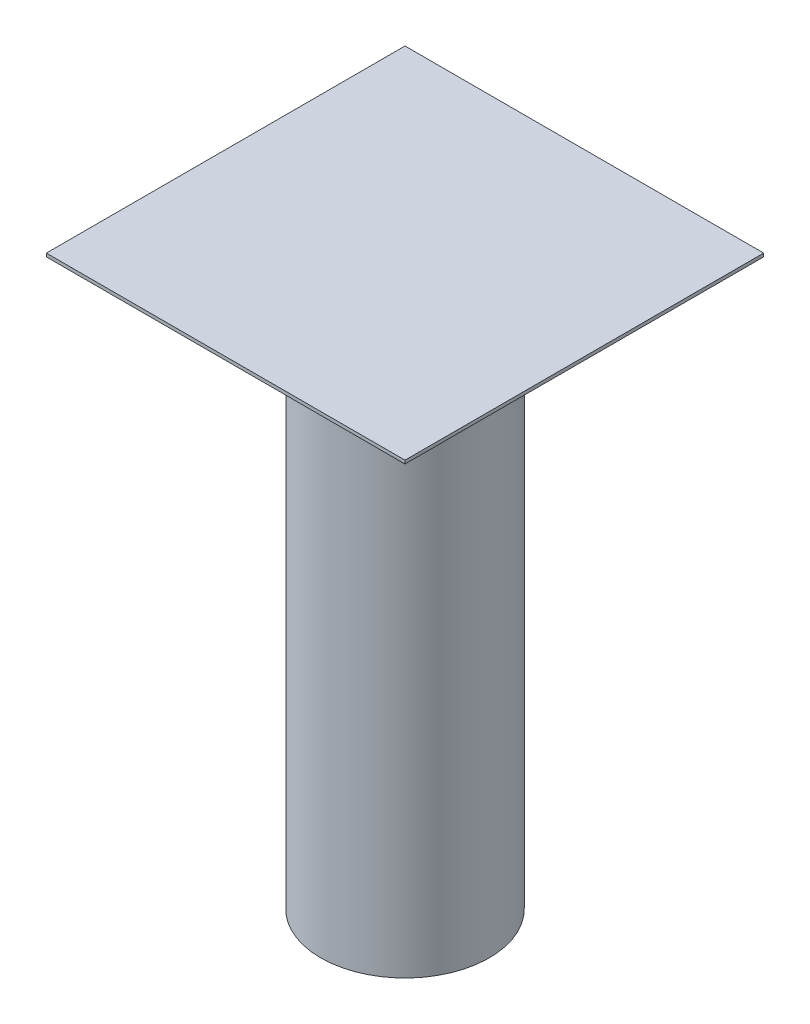
ISO-10303-21;
HEADER;
FILE_DESCRIPTION(('STEP AP214'),'2;1');
FILE_NAME('part.step','',(''),(''),'','','');
FILE_SCHEMA(('AUTOMOTIVE_DESIGN { 1 0 10303 214 1 1 1 1 }'));
ENDSEC;
DATA;
#1=APPLICATION_CONTEXT('core data for automotive mechanical design processes');
#2=APPLICATION_PROTOCOL_DEFINITION('international standard','automotive_design',2000,#1);
#3=PRODUCT_CONTEXT('',#1,'mechanical');
#4=PRODUCT('Part','Part','',(#3));
#5=PRODUCT_RELATED_PRODUCT_CATEGORY('part','',(#4));
#6=PRODUCT_DEFINITION_FORMATION('','',#4);
#7=PRODUCT_DEFINITION_CONTEXT('part definition',#1,'design');
#8=PRODUCT_DEFINITION('design','',#6,#7);
#9=PRODUCT_DEFINITION_SHAPE('','',#8);
#10=(LENGTH_UNIT() NAMED_UNIT(*) SI_UNIT(.MILLI.,.METRE.));
#11=(NAMED_UNIT(*) PLANE_ANGLE_UNIT() SI_UNIT($,.RADIAN.));
#12=(NAMED_UNIT(*) SI_UNIT($,.STERADIAN.) SOLID_ANGLE_UNIT());
#13=UNCERTAINTY_MEASURE_WITH_UNIT(LENGTH_MEASURE(1.E-05),#10,'distance_accuracy_value','');
#14=(GEOMETRIC_REPRESENTATION_CONTEXT(3) GLOBAL_UNCERTAINTY_ASSIGNED_CONTEXT((#13)) GLOBAL_UNIT_ASSIGNED_CONTEXT((#10,
#11,#12)) REPRESENTATION_CONTEXT('',''));
#15=CARTESIAN_POINT('',(0.,0.,0.));
#16=DIRECTION('',(0.,0.,1.));
#17=DIRECTION('',(1.,0.,0.));
#18=AXIS2_PLACEMENT_3D('',#15,#16,#17);
#19=CARTESIAN_POINT('',(0.,170.1,0.));
#20=DIRECTION('',(0.,-1.,0.));
#21=DIRECTION('',(0.,0.,-1.));
#22=AXIS2_PLACEMENT_3D('',#19,#20,#21);
#23=CYLINDRICAL_SURFACE('',#22,25.4);
#24=CARTESIAN_POINT('',(0.,170.1,0.));
#25=DIRECTION('',(0.,1.,0.));
#26=DIRECTION('',(0.,0.,1.));
#27=AXIS2_PLACEMENT_3D('',#24,#25,#26);
#28=CIRCLE('',#27,25.4);
#29=CARTESIAN_POINT('',(0.,170.1,25.4));
#30=VERTEX_POINT('',#29);
#31=EDGE_CURVE('E11',#30,#30,#28,.T.);
#32=ORIENTED_EDGE('',*,*,#31,.F.);
#33=EDGE_LOOP('',(#32));
#34=FACE_BOUND('',#33,.T.);
#35=CARTESIAN_POINT('',(0.,0.,0.));
#36=DIRECTION('',(0.,1.,0.));
#37=DIRECTION('',(0.,0.,1.));
#38=AXIS2_PLACEMENT_3D('',#35,#36,#37);
#39=CIRCLE('',#38,25.4);
#40=CARTESIAN_POINT('',(0.,0.,25.4));
#41=VERTEX_POINT('',#40);
#42=EDGE_CURVE('E38',#41,#41,#39,.T.);
#43=ORIENTED_EDGE('',*,*,#42,.T.);
#44=EDGE_LOOP('',(#43));
#45=FACE_BOUND('',#44,.T.);
#46=ADVANCED_FACE('F35',(#34,#45),#23,.T.);
#47=CARTESIAN_POINT('',(0.,0.,0.));
#48=DIRECTION('',(0.,1.,0.));
#49=DIRECTION('',(0.,0.,1.));
#50=AXIS2_PLACEMENT_3D('',#47,#48,#49);
#51=PLANE('',#50);
#52=CARTESIAN_POINT('',(0.,0.,0.));
#53=DIRECTION('',(0.,1.,0.));
#54=DIRECTION('',(0.,0.,1.));
#55=AXIS2_PLACEMENT_3D('',#52,#53,#54);
#56=CIRCLE('',#55,24.65);
#57=CARTESIAN_POINT('',(0.,0.,24.65));
#58=VERTEX_POINT('',#57);
#59=EDGE_CURVE('E112',#58,#58,#56,.T.);
#60=ORIENTED_EDGE('',*,*,#59,.T.);
#61=EDGE_LOOP('',(#60));
#62=FACE_BOUND('',#61,.T.);
#63=ORIENTED_EDGE('',*,*,#42,.F.);
#64=EDGE_LOOP('',(#63));
#65=FACE_BOUND('',#64,.T.);
#66=ADVANCED_FACE('F135',(#62,#65),#51,.F.);
#67=CARTESIAN_POINT('',(0.,0.,0.));
#68=DIRECTION('',(0.,1.,0.));
#69=DIRECTION('',(0.,0.,1.));
#70=AXIS2_PLACEMENT_3D('',#67,#68,#69);
#71=CYLINDRICAL_SURFACE('',#70,24.65);
#72=ORIENTED_EDGE('',*,*,#59,.F.);
#73=EDGE_LOOP('',(#72));
#74=FACE_BOUND('',#73,.T.);
#75=CARTESIAN_POINT('',(0.,170.1,0.));
#76=DIRECTION('',(0.,1.,0.));
#77=DIRECTION('',(0.,0.,1.));
#78=AXIS2_PLACEMENT_3D('',#75,#76,#77);
#79=CIRCLE('',#78,24.65);
#80=CARTESIAN_POINT('',(0.,170.1,24.65));
#81=VERTEX_POINT('',#80);
#82=EDGE_CURVE('E111',#81,#81,#79,.T.);
#83=ORIENTED_EDGE('',*,*,#82,.T.);
#84=EDGE_LOOP('',(#83));
#85=FACE_BOUND('',#84,.T.);
#86=ADVANCED_FACE('F118',(#74,#85),#71,.F.);
#87=CARTESIAN_POINT('',(0.,170.1,0.));
#88=DIRECTION('',(0.,-1.,0.));
#89=DIRECTION('',(0.,0.,-1.));
#90=AXIS2_PLACEMENT_3D('',#87,#88,#89);
#91=PLANE('',#90);
#92=ORIENTED_EDGE('',*,*,#31,.T.);
#93=EDGE_LOOP('',(#92));
#94=FACE_BOUND('',#93,.T.);
#95=DIRECTION('',(0.,0.,-1.));
#96=VECTOR('',#95,1.);
#97=CARTESIAN_POINT('',(54.,170.1,54.));
#98=LINE('',#97,#96);
#99=CARTESIAN_POINT('',(54.,170.1,54.));
#100=VERTEX_POINT('',#99);
#101=CARTESIAN_POINT('',(54.,170.1,-54.));
#102=VERTEX_POINT('',#101);
#103=EDGE_CURVE('E102',#100,#102,#98,.T.);
#104=ORIENTED_EDGE('',*,*,#103,.F.);
#105=DIRECTION('',(1.,0.,0.));
#106=VECTOR('',#105,1.);
#107=CARTESIAN_POINT('',(-54.,170.1,54.));
#108=LINE('',#107,#106);
#109=CARTESIAN_POINT('',(-54.,170.1,54.));
#110=VERTEX_POINT('',#109);
#111=EDGE_CURVE('E74',#110,#100,#108,.T.);
#112=ORIENTED_EDGE('',*,*,#111,.F.);
#113=DIRECTION('',(0.,0.,1.));
#114=VECTOR('',#113,1.);
#115=CARTESIAN_POINT('',(-54.,170.1,54.));
#116=LINE('',#115,#114);
#117=CARTESIAN_POINT('',(-54.,170.1,-54.));
#118=VERTEX_POINT('',#117);
#119=EDGE_CURVE('E68',#118,#110,#116,.T.);
#120=ORIENTED_EDGE('',*,*,#119,.F.);
#121=DIRECTION('',(-1.,0.,0.));
#122=VECTOR('',#121,1.);
#123=CARTESIAN_POINT('',(-54.,170.1,-54.));
#124=LINE('',#123,#122);
#125=EDGE_CURVE('E92',#102,#118,#124,.T.);
#126=ORIENTED_EDGE('',*,*,#125,.F.);
#127=EDGE_LOOP('',(#104,#112,#120,#126));
#128=FACE_BOUND('',#127,.T.);
#129=ADVANCED_FACE('F124',(#94,#128),#91,.T.);
#130=CARTESIAN_POINT('',(0.,171.1,0.));
#131=DIRECTION('',(0.,-1.,0.));
#132=DIRECTION('',(0.,0.,-1.));
#133=AXIS2_PLACEMENT_3D('',#130,#131,#132);
#134=PLANE('',#133);
#135=DIRECTION('',(0.,0.,-1.));
#136=VECTOR('',#135,1.);
#137=CARTESIAN_POINT('',(54.,171.1,54.));
#138=LINE('',#137,#136);
#139=CARTESIAN_POINT('',(54.,171.1,54.));
#140=VERTEX_POINT('',#139);
#141=CARTESIAN_POINT('',(54.,171.1,-54.));
#142=VERTEX_POINT('',#141);
#143=EDGE_CURVE('E87',#140,#142,#138,.T.);
#144=ORIENTED_EDGE('',*,*,#143,.T.);
#145=DIRECTION('',(-1.,0.,0.));
#146=VECTOR('',#145,1.);
#147=CARTESIAN_POINT('',(-54.,171.1,-54.));
#148=LINE('',#147,#146);
#149=CARTESIAN_POINT('',(-54.,171.1,-54.));
#150=VERTEX_POINT('',#149);
#151=EDGE_CURVE('E82',#142,#150,#148,.T.);
#152=ORIENTED_EDGE('',*,*,#151,.T.);
#153=DIRECTION('',(0.,0.,1.));
#154=VECTOR('',#153,1.);
#155=CARTESIAN_POINT('',(-54.,171.1,54.));
#156=LINE('',#155,#154);
#157=CARTESIAN_POINT('',(-54.,171.1,54.));
#158=VERTEX_POINT('',#157);
#159=EDGE_CURVE('E85',#150,#158,#156,.T.);
#160=ORIENTED_EDGE('',*,*,#159,.T.);
#161=DIRECTION('',(1.,0.,0.));
#162=VECTOR('',#161,1.);
#163=CARTESIAN_POINT('',(-54.,171.1,54.));
#164=LINE('',#163,#162);
#165=EDGE_CURVE('E51',#158,#140,#164,.T.);
#166=ORIENTED_EDGE('',*,*,#165,.T.);
#167=EDGE_LOOP('',(#144,#152,#160,#166));
#168=FACE_BOUND('',#167,.T.);
#169=ADVANCED_FACE('F83',(#168),#134,.F.);
#170=CARTESIAN_POINT('',(-54.,171.1,54.));
#171=DIRECTION('',(0.,0.,-1.));
#172=DIRECTION('',(-1.,0.,0.));
#173=AXIS2_PLACEMENT_3D('',#170,#171,#172);
#174=PLANE('',#173);
#175=ORIENTED_EDGE('',*,*,#111,.T.);
#176=DIRECTION('',(0.,-1.,0.));
#177=VECTOR('',#176,1.);
#178=CARTESIAN_POINT('',(54.,171.1,54.));
#179=LINE('',#178,#177);
#180=EDGE_CURVE('E98',#140,#100,#179,.T.);
#181=ORIENTED_EDGE('',*,*,#180,.F.);
#182=ORIENTED_EDGE('',*,*,#165,.F.);
#183=DIRECTION('',(0.,-1.,0.));
#184=VECTOR('',#183,1.);
#185=CARTESIAN_POINT('',(-54.,171.1,54.));
#186=LINE('',#185,#184);
#187=EDGE_CURVE('E94',#158,#110,#186,.T.);
#188=ORIENTED_EDGE('',*,*,#187,.T.);
#189=EDGE_LOOP('',(#175,#181,#182,#188));
#190=FACE_BOUND('',#189,.T.);
#191=ADVANCED_FACE('F148',(#190),#174,.F.);
#192=CARTESIAN_POINT('',(-54.,171.1,54.));
#193=DIRECTION('',(1.,0.,0.));
#194=DIRECTION('',(0.,0.,-1.));
#195=AXIS2_PLACEMENT_3D('',#192,#193,#194);
#196=PLANE('',#195);
#197=ORIENTED_EDGE('',*,*,#119,.T.);
#198=ORIENTED_EDGE('',*,*,#187,.F.);
#199=ORIENTED_EDGE('',*,*,#159,.F.);
#200=DIRECTION('',(0.,-1.,0.));
#201=VECTOR('',#200,1.);
#202=CARTESIAN_POINT('',(-54.,171.1,-54.));
#203=LINE('',#202,#201);
#204=EDGE_CURVE('E90',#150,#118,#203,.T.);
#205=ORIENTED_EDGE('',*,*,#204,.T.);
#206=EDGE_LOOP('',(#197,#198,#199,#205));
#207=FACE_BOUND('',#206,.T.);
#208=ADVANCED_FACE('F96',(#207),#196,.F.);
#209=CARTESIAN_POINT('',(-54.,171.1,-54.));
#210=DIRECTION('',(0.,0.,1.));
#211=DIRECTION('',(1.,0.,0.));
#212=AXIS2_PLACEMENT_3D('',#209,#210,#211);
#213=PLANE('',#212);
#214=ORIENTED_EDGE('',*,*,#125,.T.);
#215=ORIENTED_EDGE('',*,*,#204,.F.);
#216=ORIENTED_EDGE('',*,*,#151,.F.);
#217=DIRECTION('',(0.,-1.,0.));
#218=VECTOR('',#217,1.);
#219=CARTESIAN_POINT('',(54.,171.1,-54.));
#220=LINE('',#219,#218);
#221=EDGE_CURVE('E93',#142,#102,#220,.T.);
#222=ORIENTED_EDGE('',*,*,#221,.T.);
#223=EDGE_LOOP('',(#214,#215,#216,#222));
#224=FACE_BOUND('',#223,.T.);
#225=ADVANCED_FACE('F91',(#224),#213,.F.);
#226=CARTESIAN_POINT('',(54.,171.1,54.));
#227=DIRECTION('',(-1.,0.,0.));
#228=DIRECTION('',(0.,0.,1.));
#229=AXIS2_PLACEMENT_3D('',#226,#227,#228);
#230=PLANE('',#229);
#231=ORIENTED_EDGE('',*,*,#103,.T.);
#232=ORIENTED_EDGE('',*,*,#221,.F.);
#233=ORIENTED_EDGE('',*,*,#143,.F.);
#234=ORIENTED_EDGE('',*,*,#180,.T.);
#235=EDGE_LOOP('',(#231,#232,#233,#234));
#236=FACE_BOUND('',#235,.T.);
#237=ADVANCED_FACE('F122',(#236),#230,.F.);
#238=ORIENTED_EDGE('',*,*,#82,.F.);
#239=EDGE_LOOP('',(#238));
#240=FACE_BOUND('',#239,.T.);
#241=ADVANCED_FACE('F120',(#240),#91,.T.);
#242=CLOSED_SHELL('',(#46,#66,#86,#129,#169,#191,#208,#225,#237,#241));
#243=MANIFOLD_SOLID_BREP('B2',#242);
#244=ADVANCED_BREP_SHAPE_REPRESENTATION('',(#18,#243),#14);
#245=SHAPE_DEFINITION_REPRESENTATION(#9,#244);
ENDSEC;
END-ISO-10303-21;
